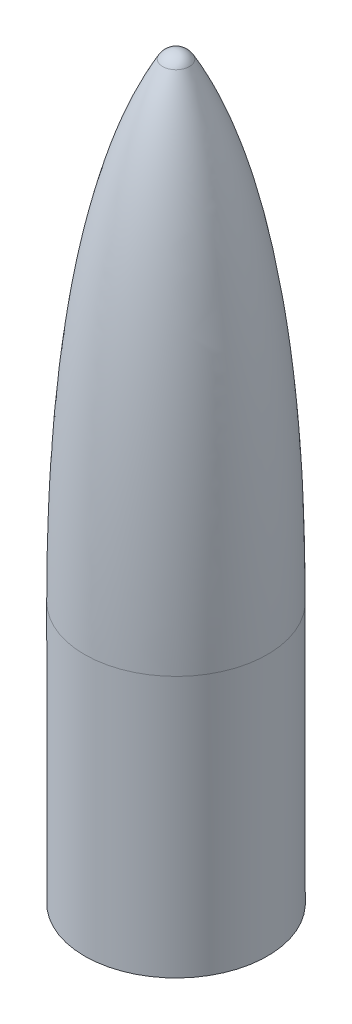
ISO-10303-21;
HEADER;
FILE_DESCRIPTION(('STEP AP214'),'2;1');
FILE_NAME('part.step','',(''),(''),'','','');
FILE_SCHEMA(('AUTOMOTIVE_DESIGN { 1 0 10303 214 1 1 1 1 }'));
ENDSEC;
DATA;
#1=APPLICATION_CONTEXT('core data for automotive mechanical design processes');
#2=APPLICATION_PROTOCOL_DEFINITION('international standard','automotive_design',2000,#1);
#3=PRODUCT_CONTEXT('',#1,'mechanical');
#4=PRODUCT('Part','Part','',(#3));
#5=PRODUCT_RELATED_PRODUCT_CATEGORY('part','',(#4));
#6=PRODUCT_DEFINITION_FORMATION('','',#4);
#7=PRODUCT_DEFINITION_CONTEXT('part definition',#1,'design');
#8=PRODUCT_DEFINITION('design','',#6,#7);
#9=PRODUCT_DEFINITION_SHAPE('','',#8);
#10=(LENGTH_UNIT() NAMED_UNIT(*) SI_UNIT(.MILLI.,.METRE.));
#11=(NAMED_UNIT(*) PLANE_ANGLE_UNIT() SI_UNIT($,.RADIAN.));
#12=(NAMED_UNIT(*) SI_UNIT($,.STERADIAN.) SOLID_ANGLE_UNIT());
#13=UNCERTAINTY_MEASURE_WITH_UNIT(LENGTH_MEASURE(1.E-05),#10,'distance_accuracy_value','');
#14=(GEOMETRIC_REPRESENTATION_CONTEXT(3) GLOBAL_UNCERTAINTY_ASSIGNED_CONTEXT((#13)) GLOBAL_UNIT_ASSIGNED_CONTEXT((#10,
#11,#12)) REPRESENTATION_CONTEXT('',''));
#15=CARTESIAN_POINT('',(0.,0.,0.));
#16=DIRECTION('',(0.,0.,1.));
#17=DIRECTION('',(1.,0.,0.));
#18=AXIS2_PLACEMENT_3D('',#15,#16,#17);
#19=CARTESIAN_POINT('',(0.,15.,0.));
#20=DIRECTION('',(0.,-1.,0.));
#21=DIRECTION('',(0.,0.,-1.));
#22=AXIS2_PLACEMENT_3D('',#19,#20,#21);
#23=CYLINDRICAL_SURFACE('',#22,14.8);
#24=CARTESIAN_POINT('',(0.,15.,0.));
#25=DIRECTION('',(0.,-1.,0.));
#26=DIRECTION('',(0.,0.,-1.));
#27=AXIS2_PLACEMENT_3D('',#24,#25,#26);
#28=CIRCLE('',#27,14.8);
#29=CARTESIAN_POINT('',(0.,15.,-14.8));
#30=VERTEX_POINT('',#29);
#31=EDGE_CURVE('E182',#30,#30,#28,.T.);
#32=ORIENTED_EDGE('',*,*,#31,.F.);
#33=EDGE_LOOP('',(#32));
#34=FACE_BOUND('',#33,.T.);
#35=DIRECTION('',(0.,-1.,0.));
#36=VECTOR('',#35,1.);
#37=CARTESIAN_POINT('',(14.1361239383361,5.,4.38292140016222));
#38=LINE('',#37,#36);
#39=CARTESIAN_POINT('',(14.1361239383361,5.,4.38292140016222));
#40=VERTEX_POINT('',#39);
#41=CARTESIAN_POINT('',(14.1361239383361,0.,4.38292140016222));
#42=VERTEX_POINT('',#41);
#43=EDGE_CURVE('E118',#40,#42,#38,.T.);
#44=ORIENTED_EDGE('',*,*,#43,.T.);
#45=CARTESIAN_POINT('',(0.,0.,0.));
#46=DIRECTION('',(0.,-1.,0.));
#47=DIRECTION('',(0.,0.,-1.));
#48=AXIS2_PLACEMENT_3D('',#45,#46,#47);
#49=CIRCLE('',#48,14.8);
#50=CARTESIAN_POINT('',(-14.1361239383361,0.,4.38292140016223));
#51=VERTEX_POINT('',#50);
#52=EDGE_CURVE('E173',#42,#51,#49,.T.);
#53=ORIENTED_EDGE('',*,*,#52,.T.);
#54=DIRECTION('',(0.,-1.,0.));
#55=VECTOR('',#54,1.);
#56=CARTESIAN_POINT('',(-14.1361239383361,5.,4.38292140016223));
#57=LINE('',#56,#55);
#58=CARTESIAN_POINT('',(-14.1361239383361,5.,4.38292140016223));
#59=VERTEX_POINT('',#58);
#60=EDGE_CURVE('E160',#59,#51,#57,.T.);
#61=ORIENTED_EDGE('',*,*,#60,.F.);
#62=CARTESIAN_POINT('',(0.,5.,0.));
#63=DIRECTION('',(0.,-1.,0.));
#64=DIRECTION('',(0.,0.,-1.));
#65=AXIS2_PLACEMENT_3D('',#62,#63,#64);
#66=CIRCLE('',#65,14.8);
#67=CARTESIAN_POINT('',(-14.1361239383361,5.,-4.38292140016223));
#68=VERTEX_POINT('',#67);
#69=EDGE_CURVE('E151',#68,#59,#66,.F.);
#70=ORIENTED_EDGE('',*,*,#69,.F.);
#71=DIRECTION('',(0.,-1.,0.));
#72=VECTOR('',#71,1.);
#73=CARTESIAN_POINT('',(-14.1361239383361,5.,-4.38292140016223));
#74=LINE('',#73,#72);
#75=CARTESIAN_POINT('',(-14.1361239383361,0.,-4.38292140016223));
#76=VERTEX_POINT('',#75);
#77=EDGE_CURVE('E177',#68,#76,#74,.T.);
#78=ORIENTED_EDGE('',*,*,#77,.T.);
#79=CARTESIAN_POINT('',(14.1361239383361,0.,-4.38292140016222));
#80=VERTEX_POINT('',#79);
#81=EDGE_CURVE('E186',#76,#80,#49,.T.);
#82=ORIENTED_EDGE('',*,*,#81,.T.);
#83=DIRECTION('',(0.,-1.,0.));
#84=VECTOR('',#83,1.);
#85=CARTESIAN_POINT('',(14.1361239383361,5.,-4.38292140016222));
#86=LINE('',#85,#84);
#87=CARTESIAN_POINT('',(14.1361239383361,5.,-4.38292140016222));
#88=VERTEX_POINT('',#87);
#89=EDGE_CURVE('E54',#88,#80,#86,.T.);
#90=ORIENTED_EDGE('',*,*,#89,.F.);
#91=CARTESIAN_POINT('',(0.,5.,0.));
#92=DIRECTION('',(0.,-1.,0.));
#93=DIRECTION('',(0.,0.,-1.));
#94=AXIS2_PLACEMENT_3D('',#91,#92,#93);
#95=CIRCLE('',#94,14.8);
#96=EDGE_CURVE('E58',#40,#88,#95,.F.);
#97=ORIENTED_EDGE('',*,*,#96,.F.);
#98=EDGE_LOOP('',(#44,#53,#61,#70,#78,#82,#90,#97));
#99=FACE_BOUND('',#98,.T.);
#100=ADVANCED_FACE('F39',(#34,#99),#23,.F.);
#101=CARTESIAN_POINT('',(0.,50.,0.));
#102=DIRECTION('',(0.,-1.,0.));
#103=DIRECTION('',(0.,0.,-1.));
#104=AXIS2_PLACEMENT_3D('',#101,#102,#103);
#105=CYLINDRICAL_SURFACE('',#104,17.5);
#106=CARTESIAN_POINT('',(0.,50.,0.));
#107=DIRECTION('',(0.,1.,0.));
#108=DIRECTION('',(0.,0.,1.));
#109=AXIS2_PLACEMENT_3D('',#106,#107,#108);
#110=CIRCLE('',#109,17.5);
#111=CARTESIAN_POINT('',(0.,50.,17.5));
#112=VERTEX_POINT('',#111);
#113=EDGE_CURVE('E11',#112,#112,#110,.T.);
#114=ORIENTED_EDGE('',*,*,#113,.F.);
#115=EDGE_LOOP('',(#114));
#116=FACE_BOUND('',#115,.T.);
#117=CARTESIAN_POINT('',(0.,0.,0.));
#118=DIRECTION('',(0.,1.,0.));
#119=DIRECTION('',(0.,0.,1.));
#120=AXIS2_PLACEMENT_3D('',#117,#118,#119);
#121=CIRCLE('',#120,17.5);
#122=CARTESIAN_POINT('',(0.,0.,17.5));
#123=VERTEX_POINT('',#122);
#124=EDGE_CURVE('E43',#123,#123,#121,.T.);
#125=ORIENTED_EDGE('',*,*,#124,.T.);
#126=EDGE_LOOP('',(#125));
#127=FACE_BOUND('',#126,.T.);
#128=ADVANCED_FACE('F41',(#116,#127),#105,.T.);
#129=CARTESIAN_POINT('',(0.,0.,0.));
#130=DIRECTION('',(0.,1.,0.));
#131=DIRECTION('',(0.,0.,1.));
#132=AXIS2_PLACEMENT_3D('',#129,#130,#131);
#133=PLANE('',#132);
#134=ORIENTED_EDGE('',*,*,#124,.F.);
#135=EDGE_LOOP('',(#134));
#136=FACE_BOUND('',#135,.T.);
#137=ORIENTED_EDGE('',*,*,#81,.F.);
#138=DIRECTION('',(-1.,0.,0.));
#139=VECTOR('',#138,1.);
#140=CARTESIAN_POINT('',(0.,0.,-4.38292140016223));
#141=LINE('',#140,#139);
#142=CARTESIAN_POINT('',(-8.30000000000001,0.,-4.38292140016223));
#143=VERTEX_POINT('',#142);
#144=EDGE_CURVE('E166',#143,#76,#141,.T.);
#145=ORIENTED_EDGE('',*,*,#144,.F.);
#146=CARTESIAN_POINT('',(-8.3,0.,0.));
#147=DIRECTION('',(0.,-1.,0.));
#148=DIRECTION('',(0.,0.,-1.));
#149=AXIS2_PLACEMENT_3D('',#146,#147,#148);
#150=CIRCLE('',#149,4.38292140016223);
#151=CARTESIAN_POINT('',(-8.29999999999995,0.,4.38292140016223));
#152=VERTEX_POINT('',#151);
#153=EDGE_CURVE('E148',#152,#143,#150,.F.);
#154=ORIENTED_EDGE('',*,*,#153,.F.);
#155=DIRECTION('',(-1.,0.,0.));
#156=VECTOR('',#155,1.);
#157=CARTESIAN_POINT('',(0.,0.,4.38292140016223));
#158=LINE('',#157,#156);
#159=EDGE_CURVE('E163',#152,#51,#158,.T.);
#160=ORIENTED_EDGE('',*,*,#159,.T.);
#161=ORIENTED_EDGE('',*,*,#52,.F.);
#162=DIRECTION('',(1.,0.,0.));
#163=VECTOR('',#162,1.);
#164=CARTESIAN_POINT('',(0.,0.,4.38292140016222));
#165=LINE('',#164,#163);
#166=CARTESIAN_POINT('',(8.29999999999995,0.,4.38292140016222));
#167=VERTEX_POINT('',#166);
#168=EDGE_CURVE('E134',#167,#42,#165,.T.);
#169=ORIENTED_EDGE('',*,*,#168,.F.);
#170=CARTESIAN_POINT('',(8.3,0.,0.));
#171=DIRECTION('',(0.,-1.,0.));
#172=DIRECTION('',(0.,0.,-1.));
#173=AXIS2_PLACEMENT_3D('',#170,#171,#172);
#174=CIRCLE('',#173,4.38292140016222);
#175=CARTESIAN_POINT('',(8.30000000000001,0.,-4.38292140016222));
#176=VERTEX_POINT('',#175);
#177=EDGE_CURVE('E109',#167,#176,#174,.T.);
#178=ORIENTED_EDGE('',*,*,#177,.T.);
#179=DIRECTION('',(1.,0.,0.));
#180=VECTOR('',#179,1.);
#181=CARTESIAN_POINT('',(0.,0.,-4.38292140016222));
#182=LINE('',#181,#180);
#183=EDGE_CURVE('E137',#176,#80,#182,.T.);
#184=ORIENTED_EDGE('',*,*,#183,.T.);
#185=EDGE_LOOP('',(#137,#145,#154,#160,#161,#169,#178,#184));
#186=FACE_BOUND('',#185,.T.);
#187=CARTESIAN_POINT('',(-8.3,0.,0.));
#188=DIRECTION('',(0.,-1.,0.));
#189=DIRECTION('',(0.,0.,-1.));
#190=AXIS2_PLACEMENT_3D('',#187,#188,#189);
#191=CIRCLE('',#190,2.2);
#192=CARTESIAN_POINT('',(-8.3,0.,-2.2));
#193=VERTEX_POINT('',#192);
#194=EDGE_CURVE('E141',#193,#193,#191,.T.);
#195=ORIENTED_EDGE('',*,*,#194,.F.);
#196=EDGE_LOOP('',(#195));
#197=FACE_BOUND('',#196,.T.);
#198=CARTESIAN_POINT('',(8.3,0.,0.));
#199=DIRECTION('',(0.,-1.,0.));
#200=DIRECTION('',(0.,0.,-1.));
#201=AXIS2_PLACEMENT_3D('',#198,#199,#200);
#202=CIRCLE('',#201,2.2);
#203=CARTESIAN_POINT('',(8.3,0.,-2.2));
#204=VERTEX_POINT('',#203);
#205=EDGE_CURVE('E131',#204,#204,#202,.F.);
#206=ORIENTED_EDGE('',*,*,#205,.T.);
#207=EDGE_LOOP('',(#206));
#208=FACE_BOUND('',#207,.T.);
#209=ADVANCED_FACE('F213',(#136,#186,#197,#208),#133,.F.);
#210=CARTESIAN_POINT('',(0.,138.55443864119,0.));
#211=DIRECTION('',(0.,-1.,0.));
#212=DIRECTION('',(-1.,0.,0.));
#213=AXIS2_PLACEMENT_3D('',#210,#211,#212);
#214=SPHERICAL_SURFACE('',#213,2.93123653806434);
#215=CARTESIAN_POINT('',(0.,140.,0.));
#216=DIRECTION('',(0.,-1.,0.));
#217=DIRECTION('',(0.,0.,-1.));
#218=AXIS2_PLACEMENT_3D('',#215,#216,#217);
#219=CIRCLE('',#218,2.55000000000001);
#220=CARTESIAN_POINT('',(0.,140.,-2.55000000000001));
#221=VERTEX_POINT('',#220);
#222=EDGE_CURVE('E193',#221,#221,#219,.T.);
#223=ORIENTED_EDGE('',*,*,#222,.F.);
#224=EDGE_LOOP('',(#223));
#225=FACE_BOUND('',#224,.T.);
#226=ADVANCED_FACE('F215',(#225),#214,.T.);
#227=CARTESIAN_POINT('',(-2.55,140.,0.));
#228=CARTESIAN_POINT('',(-17.5,113.627892190343,0.));
#229=CARTESIAN_POINT('',(-17.5,50.,0.));
#230=B_SPLINE_CURVE_WITH_KNOTS('',2,(#227,#228,#229),.UNSPECIFIED.,.F.,.F.,(3,3),(0.,1.),.UNSPECIFIED.);
#231=CARTESIAN_POINT('',(0.,50.,0.));
#232=DIRECTION('',(0.,-1.,0.));
#233=AXIS1_PLACEMENT('',#231,#232);
#234=SURFACE_OF_REVOLUTION('',#230,#233);
#235=ORIENTED_EDGE('',*,*,#113,.T.);
#236=EDGE_LOOP('',(#235));
#237=FACE_BOUND('',#236,.T.);
#238=ORIENTED_EDGE('',*,*,#222,.T.);
#239=EDGE_LOOP('',(#238));
#240=FACE_BOUND('',#239,.T.);
#241=ADVANCED_FACE('F221',(#237,#240),#234,.T.);
#242=CARTESIAN_POINT('',(0.,15.,0.));
#243=DIRECTION('',(0.,-1.,0.));
#244=DIRECTION('',(0.,0.,-1.));
#245=AXIS2_PLACEMENT_3D('',#242,#243,#244);
#246=PLANE('',#245);
#247=ORIENTED_EDGE('',*,*,#31,.T.);
#248=EDGE_LOOP('',(#247));
#249=FACE_BOUND('',#248,.T.);
#250=CARTESIAN_POINT('',(0.,15.,0.));
#251=DIRECTION('',(0.,-1.,0.));
#252=DIRECTION('',(0.,0.,-1.));
#253=AXIS2_PLACEMENT_3D('',#250,#251,#252);
#254=CIRCLE('',#253,16.3);
#255=CARTESIAN_POINT('',(0.,15.,-16.3));
#256=VERTEX_POINT('',#255);
#257=EDGE_CURVE('E185',#256,#256,#254,.F.);
#258=ORIENTED_EDGE('',*,*,#257,.T.);
#259=EDGE_LOOP('',(#258));
#260=FACE_BOUND('',#259,.T.);
#261=ADVANCED_FACE('F234',(#249,#260),#246,.F.);
#262=CARTESIAN_POINT('',(0.,138.8,0.));
#263=DIRECTION('',(0.,-1.,0.));
#264=DIRECTION('',(0.,0.,-1.));
#265=AXIS2_PLACEMENT_3D('',#262,#263,#264);
#266=PLANE('',#265);
#267=CARTESIAN_POINT('',(0.,138.8,0.));
#268=DIRECTION('',(0.,-1.,0.));
#269=DIRECTION('',(0.,0.,-1.));
#270=AXIS2_PLACEMENT_3D('',#267,#268,#269);
#271=CIRCLE('',#270,2.);
#272=CARTESIAN_POINT('',(0.,138.8,-2.));
#273=VERTEX_POINT('',#272);
#274=EDGE_CURVE('E250',#273,#273,#271,.T.);
#275=ORIENTED_EDGE('',*,*,#274,.T.);
#276=EDGE_LOOP('',(#275));
#277=FACE_BOUND('',#276,.T.);
#278=ADVANCED_FACE('F210',(#277),#266,.T.);
#279=CARTESIAN_POINT('',(-2.,138.8,0.));
#280=CARTESIAN_POINT('',(-16.3,113.627892190343,0.));
#281=CARTESIAN_POINT('',(-16.3,50.,0.));
#282=B_SPLINE_CURVE_WITH_KNOTS('',2,(#279,#280,#281),.UNSPECIFIED.,.F.,.F.,(3,3),(0.,1.),.UNSPECIFIED.);
#283=CARTESIAN_POINT('',(0.,50.,0.));
#284=DIRECTION('',(0.,-1.,0.));
#285=AXIS1_PLACEMENT('',#283,#284);
#286=SURFACE_OF_REVOLUTION('',#282,#285);
#287=CARTESIAN_POINT('',(0.,50.,0.));
#288=DIRECTION('',(0.,1.,0.));
#289=DIRECTION('',(0.,0.,1.));
#290=AXIS2_PLACEMENT_3D('',#287,#288,#289);
#291=CIRCLE('',#290,16.3);
#292=CARTESIAN_POINT('',(0.,50.,16.3));
#293=VERTEX_POINT('',#292);
#294=EDGE_CURVE('E189',#293,#293,#291,.T.);
#295=ORIENTED_EDGE('',*,*,#294,.F.);
#296=EDGE_LOOP('',(#295));
#297=FACE_BOUND('',#296,.T.);
#298=ORIENTED_EDGE('',*,*,#274,.F.);
#299=EDGE_LOOP('',(#298));
#300=FACE_BOUND('',#299,.T.);
#301=ADVANCED_FACE('F206',(#297,#300),#286,.F.);
#302=CARTESIAN_POINT('',(0.,141.486675179255,0.));
#303=DIRECTION('',(0.,-1.,0.));
#304=DIRECTION('',(0.,0.,-1.));
#305=AXIS2_PLACEMENT_3D('',#302,#303,#304);
#306=CYLINDRICAL_SURFACE('',#305,16.3);
#307=ORIENTED_EDGE('',*,*,#294,.T.);
#308=EDGE_LOOP('',(#307));
#309=FACE_BOUND('',#308,.T.);
#310=ORIENTED_EDGE('',*,*,#257,.F.);
#311=EDGE_LOOP('',(#310));
#312=FACE_BOUND('',#311,.T.);
#313=ADVANCED_FACE('F209',(#309,#312),#306,.F.);
#314=CARTESIAN_POINT('',(0.,5.,4.38292140016223));
#315=DIRECTION('',(0.,0.,1.));
#316=DIRECTION('',(1.,0.,0.));
#317=AXIS2_PLACEMENT_3D('',#314,#315,#316);
#318=PLANE('',#317);
#319=ORIENTED_EDGE('',*,*,#159,.F.);
#320=DIRECTION('',(0.,-1.,0.));
#321=VECTOR('',#320,1.);
#322=CARTESIAN_POINT('',(-8.29999999999995,5.,4.38292140016223));
#323=LINE('',#322,#321);
#324=CARTESIAN_POINT('',(-8.29999999999995,5.,4.38292140016223));
#325=VERTEX_POINT('',#324);
#326=EDGE_CURVE('E171',#325,#152,#323,.T.);
#327=ORIENTED_EDGE('',*,*,#326,.F.);
#328=DIRECTION('',(-1.,0.,0.));
#329=VECTOR('',#328,1.);
#330=CARTESIAN_POINT('',(0.,5.,4.38292140016223));
#331=LINE('',#330,#329);
#332=EDGE_CURVE('E147',#325,#59,#331,.T.);
#333=ORIENTED_EDGE('',*,*,#332,.T.);
#334=ORIENTED_EDGE('',*,*,#60,.T.);
#335=EDGE_LOOP('',(#319,#327,#333,#334));
#336=FACE_BOUND('',#335,.T.);
#337=ADVANCED_FACE('F238',(#336),#318,.T.);
#338=CARTESIAN_POINT('',(-8.3,5.,0.));
#339=DIRECTION('',(0.,-1.,0.));
#340=DIRECTION('',(0.,0.,-1.));
#341=AXIS2_PLACEMENT_3D('',#338,#339,#340);
#342=CYLINDRICAL_SURFACE('',#341,4.38292140016223);
#343=ORIENTED_EDGE('',*,*,#153,.T.);
#344=DIRECTION('',(0.,-1.,0.));
#345=VECTOR('',#344,1.);
#346=CARTESIAN_POINT('',(-8.30000000000001,5.,-4.38292140016223));
#347=LINE('',#346,#345);
#348=CARTESIAN_POINT('',(-8.30000000000001,5.,-4.38292140016223));
#349=VERTEX_POINT('',#348);
#350=EDGE_CURVE('E174',#349,#143,#347,.T.);
#351=ORIENTED_EDGE('',*,*,#350,.F.);
#352=CARTESIAN_POINT('',(-8.3,5.,0.));
#353=DIRECTION('',(0.,-1.,0.));
#354=DIRECTION('',(0.,0.,-1.));
#355=AXIS2_PLACEMENT_3D('',#352,#353,#354);
#356=CIRCLE('',#355,4.38292140016223);
#357=EDGE_CURVE('E157',#325,#349,#356,.F.);
#358=ORIENTED_EDGE('',*,*,#357,.F.);
#359=ORIENTED_EDGE('',*,*,#326,.T.);
#360=EDGE_LOOP('',(#343,#351,#358,#359));
#361=FACE_BOUND('',#360,.T.);
#362=ADVANCED_FACE('F277',(#361),#342,.T.);
#363=CARTESIAN_POINT('',(0.,5.,-4.38292140016223));
#364=DIRECTION('',(0.,0.,1.));
#365=DIRECTION('',(1.,0.,0.));
#366=AXIS2_PLACEMENT_3D('',#363,#364,#365);
#367=PLANE('',#366);
#368=ORIENTED_EDGE('',*,*,#144,.T.);
#369=ORIENTED_EDGE('',*,*,#77,.F.);
#370=DIRECTION('',(-1.,0.,0.));
#371=VECTOR('',#370,1.);
#372=CARTESIAN_POINT('',(0.,5.,-4.38292140016223));
#373=LINE('',#372,#371);
#374=EDGE_CURVE('E154',#349,#68,#373,.T.);
#375=ORIENTED_EDGE('',*,*,#374,.F.);
#376=ORIENTED_EDGE('',*,*,#350,.T.);
#377=EDGE_LOOP('',(#368,#369,#375,#376));
#378=FACE_BOUND('',#377,.T.);
#379=ADVANCED_FACE('F285',(#378),#367,.F.);
#380=CARTESIAN_POINT('',(-8.3,5.,0.));
#381=DIRECTION('',(0.,-1.,0.));
#382=DIRECTION('',(0.,0.,-1.));
#383=AXIS2_PLACEMENT_3D('',#380,#381,#382);
#384=CYLINDRICAL_SURFACE('',#383,2.2);
#385=CARTESIAN_POINT('',(-8.3,5.,0.));
#386=DIRECTION('',(0.,-1.,0.));
#387=DIRECTION('',(0.,0.,-1.));
#388=AXIS2_PLACEMENT_3D('',#385,#386,#387);
#389=CIRCLE('',#388,2.2);
#390=CARTESIAN_POINT('',(-8.3,5.,-2.2));
#391=VERTEX_POINT('',#390);
#392=EDGE_CURVE('E144',#391,#391,#389,.T.);
#393=ORIENTED_EDGE('',*,*,#392,.F.);
#394=EDGE_LOOP('',(#393));
#395=FACE_BOUND('',#394,.T.);
#396=ORIENTED_EDGE('',*,*,#194,.T.);
#397=EDGE_LOOP('',(#396));
#398=FACE_BOUND('',#397,.T.);
#399=ADVANCED_FACE('F293',(#395,#398),#384,.F.);
#400=CARTESIAN_POINT('',(0.,5.,0.));
#401=DIRECTION('',(0.,-1.,0.));
#402=DIRECTION('',(0.,0.,-1.));
#403=AXIS2_PLACEMENT_3D('',#400,#401,#402);
#404=PLANE('',#403);
#405=ORIENTED_EDGE('',*,*,#392,.T.);
#406=EDGE_LOOP('',(#405));
#407=FACE_BOUND('',#406,.T.);
#408=ORIENTED_EDGE('',*,*,#332,.F.);
#409=ORIENTED_EDGE('',*,*,#357,.T.);
#410=ORIENTED_EDGE('',*,*,#374,.T.);
#411=ORIENTED_EDGE('',*,*,#69,.T.);
#412=EDGE_LOOP('',(#408,#409,#410,#411));
#413=FACE_BOUND('',#412,.T.);
#414=ADVANCED_FACE('F301',(#407,#413),#404,.F.);
#415=CARTESIAN_POINT('',(0.,5.,4.38292140016222));
#416=DIRECTION('',(0.,0.,-1.));
#417=DIRECTION('',(-1.,0.,0.));
#418=AXIS2_PLACEMENT_3D('',#415,#416,#417);
#419=PLANE('',#418);
#420=ORIENTED_EDGE('',*,*,#168,.T.);
#421=ORIENTED_EDGE('',*,*,#43,.F.);
#422=DIRECTION('',(1.,0.,0.));
#423=VECTOR('',#422,1.);
#424=CARTESIAN_POINT('',(0.,5.,4.38292140016222));
#425=LINE('',#424,#423);
#426=CARTESIAN_POINT('',(8.29999999999995,5.,4.38292140016222));
#427=VERTEX_POINT('',#426);
#428=EDGE_CURVE('E116',#427,#40,#425,.T.);
#429=ORIENTED_EDGE('',*,*,#428,.F.);
#430=DIRECTION('',(0.,-1.,0.));
#431=VECTOR('',#430,1.);
#432=CARTESIAN_POINT('',(8.29999999999995,5.,4.38292140016222));
#433=LINE('',#432,#431);
#434=EDGE_CURVE('E103',#427,#167,#433,.T.);
#435=ORIENTED_EDGE('',*,*,#434,.T.);
#436=EDGE_LOOP('',(#420,#421,#429,#435));
#437=FACE_BOUND('',#436,.T.);
#438=ADVANCED_FACE('F117',(#437),#419,.F.);
#439=CARTESIAN_POINT('',(0.,5.,-4.38292140016222));
#440=DIRECTION('',(0.,0.,-1.));
#441=DIRECTION('',(-1.,0.,0.));
#442=AXIS2_PLACEMENT_3D('',#439,#440,#441);
#443=PLANE('',#442);
#444=ORIENTED_EDGE('',*,*,#183,.F.);
#445=DIRECTION('',(0.,-1.,0.));
#446=VECTOR('',#445,1.);
#447=CARTESIAN_POINT('',(8.30000000000001,5.,-4.38292140016222));
#448=LINE('',#447,#446);
#449=CARTESIAN_POINT('',(8.30000000000001,5.,-4.38292140016222));
#450=VERTEX_POINT('',#449);
#451=EDGE_CURVE('E113',#450,#176,#448,.T.);
#452=ORIENTED_EDGE('',*,*,#451,.F.);
#453=DIRECTION('',(1.,0.,0.));
#454=VECTOR('',#453,1.);
#455=CARTESIAN_POINT('',(0.,5.,-4.38292140016222));
#456=LINE('',#455,#454);
#457=EDGE_CURVE('E125',#450,#88,#456,.T.);
#458=ORIENTED_EDGE('',*,*,#457,.T.);
#459=ORIENTED_EDGE('',*,*,#89,.T.);
#460=EDGE_LOOP('',(#444,#452,#458,#459));
#461=FACE_BOUND('',#460,.T.);
#462=ADVANCED_FACE('F315',(#461),#443,.T.);
#463=CARTESIAN_POINT('',(8.3,5.,0.));
#464=DIRECTION('',(0.,-1.,0.));
#465=DIRECTION('',(0.,0.,-1.));
#466=AXIS2_PLACEMENT_3D('',#463,#464,#465);
#467=CYLINDRICAL_SURFACE('',#466,2.2);
#468=CARTESIAN_POINT('',(8.3,5.,0.));
#469=DIRECTION('',(0.,-1.,0.));
#470=DIRECTION('',(0.,0.,-1.));
#471=AXIS2_PLACEMENT_3D('',#468,#469,#470);
#472=CIRCLE('',#471,2.2);
#473=CARTESIAN_POINT('',(8.3,5.,-2.2));
#474=VERTEX_POINT('',#473);
#475=EDGE_CURVE('E120',#474,#474,#472,.F.);
#476=ORIENTED_EDGE('',*,*,#475,.T.);
#477=EDGE_LOOP('',(#476));
#478=FACE_BOUND('',#477,.T.);
#479=ORIENTED_EDGE('',*,*,#205,.F.);
#480=EDGE_LOOP('',(#479));
#481=FACE_BOUND('',#480,.T.);
#482=ADVANCED_FACE('F322',(#478,#481),#467,.F.);
#483=CARTESIAN_POINT('',(8.3,5.,0.));
#484=DIRECTION('',(0.,-1.,0.));
#485=DIRECTION('',(0.,0.,-1.));
#486=AXIS2_PLACEMENT_3D('',#483,#484,#485);
#487=CYLINDRICAL_SURFACE('',#486,4.38292140016222);
#488=ORIENTED_EDGE('',*,*,#177,.F.);
#489=ORIENTED_EDGE('',*,*,#434,.F.);
#490=CARTESIAN_POINT('',(8.3,5.,0.));
#491=DIRECTION('',(0.,-1.,0.));
#492=DIRECTION('',(0.,0.,-1.));
#493=AXIS2_PLACEMENT_3D('',#490,#491,#492);
#494=CIRCLE('',#493,4.38292140016222);
#495=EDGE_CURVE('E107',#427,#450,#494,.T.);
#496=ORIENTED_EDGE('',*,*,#495,.T.);
#497=ORIENTED_EDGE('',*,*,#451,.T.);
#498=EDGE_LOOP('',(#488,#489,#496,#497));
#499=FACE_BOUND('',#498,.T.);
#500=ADVANCED_FACE('F105',(#499),#487,.T.);
#501=CARTESIAN_POINT('',(0.,5.,0.));
#502=DIRECTION('',(0.,-1.,0.));
#503=DIRECTION('',(0.,0.,-1.));
#504=AXIS2_PLACEMENT_3D('',#501,#502,#503);
#505=PLANE('',#504);
#506=ORIENTED_EDGE('',*,*,#475,.F.);
#507=EDGE_LOOP('',(#506));
#508=FACE_BOUND('',#507,.T.);
#509=ORIENTED_EDGE('',*,*,#428,.T.);
#510=ORIENTED_EDGE('',*,*,#96,.T.);
#511=ORIENTED_EDGE('',*,*,#457,.F.);
#512=ORIENTED_EDGE('',*,*,#495,.F.);
#513=EDGE_LOOP('',(#509,#510,#511,#512));
#514=FACE_BOUND('',#513,.T.);
#515=ADVANCED_FACE('F123',(#508,#514),#505,.F.);
#516=CLOSED_SHELL('',(#100,#128,#209,#226,#241,#261,#278,#301,#313,#337,#362,#379,#399,#414,
#438,#462,#482,#500,#515));
#517=MANIFOLD_SOLID_BREP('B2',#516);
#518=ADVANCED_BREP_SHAPE_REPRESENTATION('',(#18,#517),#14);
#519=SHAPE_DEFINITION_REPRESENTATION(#9,#518);
ENDSEC;
END-ISO-10303-21;
